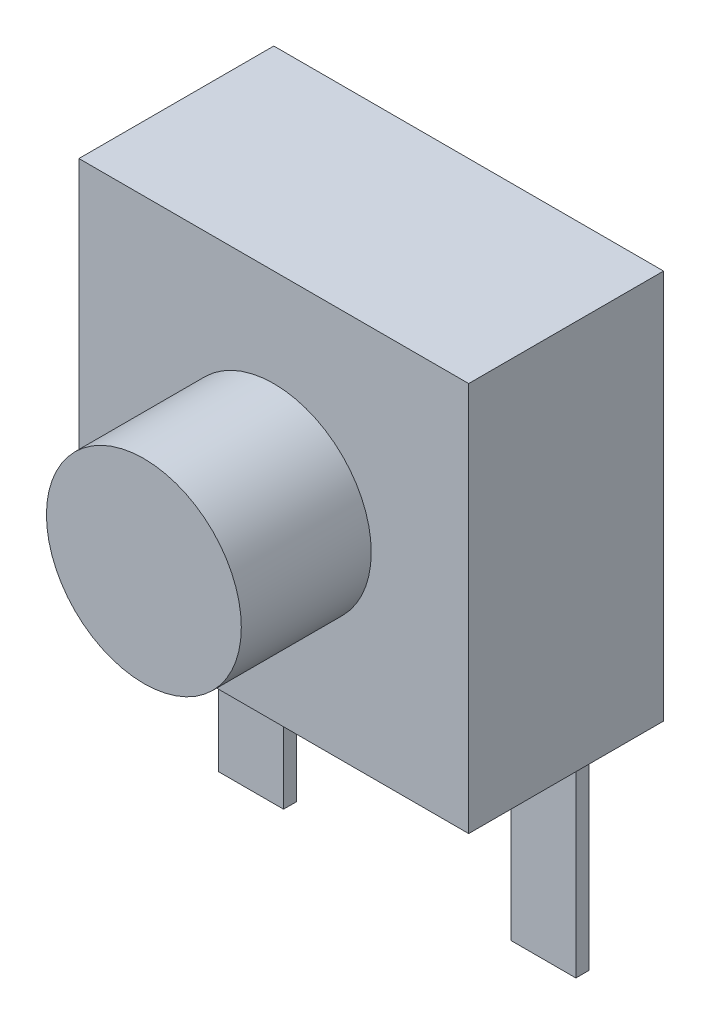
ISO-10303-21;
HEADER;
FILE_DESCRIPTION(('STEP AP214'),'2;1');
FILE_NAME('part.step','',(''),(''),'','','');
FILE_SCHEMA(('AUTOMOTIVE_DESIGN { 1 0 10303 214 1 1 1 1 }'));
ENDSEC;
DATA;
#1=APPLICATION_CONTEXT('core data for automotive mechanical design processes');
#2=APPLICATION_PROTOCOL_DEFINITION('international standard','automotive_design',2000,#1);
#3=PRODUCT_CONTEXT('',#1,'mechanical');
#4=PRODUCT('Part','Part','',(#3));
#5=PRODUCT_RELATED_PRODUCT_CATEGORY('part','',(#4));
#6=PRODUCT_DEFINITION_FORMATION('','',#4);
#7=PRODUCT_DEFINITION_CONTEXT('part definition',#1,'design');
#8=PRODUCT_DEFINITION('design','',#6,#7);
#9=PRODUCT_DEFINITION_SHAPE('','',#8);
#10=(LENGTH_UNIT() NAMED_UNIT(*) SI_UNIT(.MILLI.,.METRE.));
#11=(NAMED_UNIT(*) PLANE_ANGLE_UNIT() SI_UNIT($,.RADIAN.));
#12=(NAMED_UNIT(*) SI_UNIT($,.STERADIAN.) SOLID_ANGLE_UNIT());
#13=UNCERTAINTY_MEASURE_WITH_UNIT(LENGTH_MEASURE(1.E-05),#10,'distance_accuracy_value','');
#14=(GEOMETRIC_REPRESENTATION_CONTEXT(3) GLOBAL_UNCERTAINTY_ASSIGNED_CONTEXT((#13)) GLOBAL_UNIT_ASSIGNED_CONTEXT((#10,
#11,#12)) REPRESENTATION_CONTEXT('',''));
#15=CARTESIAN_POINT('',(0.,0.,0.));
#16=DIRECTION('',(0.,0.,1.));
#17=DIRECTION('',(1.,0.,0.));
#18=AXIS2_PLACEMENT_3D('',#15,#16,#17);
#19=CARTESIAN_POINT('',(-3.00000000000002,-3.,3.));
#20=DIRECTION('',(0.,1.,0.));
#21=DIRECTION('',(0.,0.,1.));
#22=AXIS2_PLACEMENT_3D('',#19,#20,#21);
#23=PLANE('',#22);
#24=DIRECTION('',(0.,0.,-1.));
#25=VECTOR('',#24,1.);
#26=CARTESIAN_POINT('',(-1.75,-3.,1.1));
#27=LINE('',#26,#25);
#28=CARTESIAN_POINT('',(-1.75,-3.,1.1));
#29=VERTEX_POINT('',#28);
#30=CARTESIAN_POINT('',(-1.75,-3.,0.9));
#31=VERTEX_POINT('',#30);
#32=EDGE_CURVE('E157',#29,#31,#27,.T.);
#33=ORIENTED_EDGE('',*,*,#32,.T.);
#34=DIRECTION('',(-1.,0.,0.));
#35=VECTOR('',#34,1.);
#36=CARTESIAN_POINT('',(-1.75,-3.,0.9));
#37=LINE('',#36,#35);
#38=CARTESIAN_POINT('',(-2.75,-3.,0.9));
#39=VERTEX_POINT('',#38);
#40=EDGE_CURVE('E131',#31,#39,#37,.T.);
#41=ORIENTED_EDGE('',*,*,#40,.T.);
#42=DIRECTION('',(0.,0.,1.));
#43=VECTOR('',#42,1.);
#44=CARTESIAN_POINT('',(-2.75,-3.,1.1));
#45=LINE('',#44,#43);
#46=CARTESIAN_POINT('',(-2.75,-3.,1.1));
#47=VERTEX_POINT('',#46);
#48=EDGE_CURVE('E147',#39,#47,#45,.T.);
#49=ORIENTED_EDGE('',*,*,#48,.T.);
#50=DIRECTION('',(1.,0.,0.));
#51=VECTOR('',#50,1.);
#52=CARTESIAN_POINT('',(-1.75,-3.,1.1));
#53=LINE('',#52,#51);
#54=EDGE_CURVE('E51',#47,#29,#53,.T.);
#55=ORIENTED_EDGE('',*,*,#54,.T.);
#56=EDGE_LOOP('',(#33,#41,#49,#55));
#57=FACE_BOUND('',#56,.T.);
#58=DIRECTION('',(1.,0.,0.));
#59=VECTOR('',#58,1.);
#60=CARTESIAN_POINT('',(-3.00000000000002,-3.,0.));
#61=LINE('',#60,#59);
#62=CARTESIAN_POINT('',(-3.00000000000002,-3.,0.));
#63=VERTEX_POINT('',#62);
#64=CARTESIAN_POINT('',(3.,-3.,0.));
#65=VERTEX_POINT('',#64);
#66=EDGE_CURVE('E198',#63,#65,#61,.T.);
#67=ORIENTED_EDGE('',*,*,#66,.T.);
#68=DIRECTION('',(0.,0.,-1.));
#69=VECTOR('',#68,1.);
#70=CARTESIAN_POINT('',(3.,-3.,3.));
#71=LINE('',#70,#69);
#72=CARTESIAN_POINT('',(3.,-3.,3.));
#73=VERTEX_POINT('',#72);
#74=EDGE_CURVE('E44',#73,#65,#71,.T.);
#75=ORIENTED_EDGE('',*,*,#74,.F.);
#76=DIRECTION('',(1.,0.,0.));
#77=VECTOR('',#76,1.);
#78=CARTESIAN_POINT('',(-3.00000000000002,-3.,3.));
#79=LINE('',#78,#77);
#80=CARTESIAN_POINT('',(-3.00000000000002,-3.,3.));
#81=VERTEX_POINT('',#80);
#82=EDGE_CURVE('E199',#81,#73,#79,.T.);
#83=ORIENTED_EDGE('',*,*,#82,.F.);
#84=DIRECTION('',(0.,0.,-1.));
#85=VECTOR('',#84,1.);
#86=CARTESIAN_POINT('',(-3.00000000000002,-3.,3.));
#87=LINE('',#86,#85);
#88=EDGE_CURVE('E209',#81,#63,#87,.T.);
#89=ORIENTED_EDGE('',*,*,#88,.T.);
#90=EDGE_LOOP('',(#67,#75,#83,#89));
#91=FACE_BOUND('',#90,.T.);
#92=DIRECTION('',(1.,0.,0.));
#93=VECTOR('',#92,1.);
#94=CARTESIAN_POINT('',(1.75,-3.,0.9));
#95=LINE('',#94,#93);
#96=CARTESIAN_POINT('',(1.75,-3.,0.9));
#97=VERTEX_POINT('',#96);
#98=CARTESIAN_POINT('',(2.75,-3.,0.9));
#99=VERTEX_POINT('',#98);
#100=EDGE_CURVE('E136',#97,#99,#95,.T.);
#101=ORIENTED_EDGE('',*,*,#100,.F.);
#102=DIRECTION('',(0.,0.,-1.));
#103=VECTOR('',#102,1.);
#104=CARTESIAN_POINT('',(1.75,-3.,1.1));
#105=LINE('',#104,#103);
#106=CARTESIAN_POINT('',(1.75,-3.,1.1));
#107=VERTEX_POINT('',#106);
#108=EDGE_CURVE('E170',#107,#97,#105,.T.);
#109=ORIENTED_EDGE('',*,*,#108,.F.);
#110=DIRECTION('',(-1.,0.,0.));
#111=VECTOR('',#110,1.);
#112=CARTESIAN_POINT('',(1.75,-3.,1.1));
#113=LINE('',#112,#111);
#114=CARTESIAN_POINT('',(2.75,-3.,1.1));
#115=VERTEX_POINT('',#114);
#116=EDGE_CURVE('E180',#115,#107,#113,.T.);
#117=ORIENTED_EDGE('',*,*,#116,.F.);
#118=DIRECTION('',(0.,0.,1.));
#119=VECTOR('',#118,1.);
#120=CARTESIAN_POINT('',(2.75,-3.,1.1));
#121=LINE('',#120,#119);
#122=EDGE_CURVE('E59',#99,#115,#121,.T.);
#123=ORIENTED_EDGE('',*,*,#122,.F.);
#124=EDGE_LOOP('',(#101,#109,#117,#123));
#125=FACE_BOUND('',#124,.T.);
#126=ADVANCED_FACE('F37',(#57,#91,#125),#23,.F.);
#127=CARTESIAN_POINT('',(3.,-3.,3.));
#128=DIRECTION('',(0.,0.,-1.));
#129=DIRECTION('',(-1.,0.,0.));
#130=AXIS2_PLACEMENT_3D('',#127,#128,#129);
#131=PLANE('',#130);
#132=ORIENTED_EDGE('',*,*,#82,.T.);
#133=DIRECTION('',(0.,1.,0.));
#134=VECTOR('',#133,1.);
#135=CARTESIAN_POINT('',(3.,3.,3.));
#136=LINE('',#135,#134);
#137=CARTESIAN_POINT('',(3.,3.,3.));
#138=VERTEX_POINT('',#137);
#139=EDGE_CURVE('E202',#73,#138,#136,.T.);
#140=ORIENTED_EDGE('',*,*,#139,.T.);
#141=DIRECTION('',(-1.,0.,0.));
#142=VECTOR('',#141,1.);
#143=CARTESIAN_POINT('',(-3.00000000000002,3.,3.));
#144=LINE('',#143,#142);
#145=CARTESIAN_POINT('',(-3.00000000000002,3.,3.));
#146=VERTEX_POINT('',#145);
#147=EDGE_CURVE('E205',#138,#146,#144,.T.);
#148=ORIENTED_EDGE('',*,*,#147,.T.);
#149=DIRECTION('',(0.,-1.,0.));
#150=VECTOR('',#149,1.);
#151=CARTESIAN_POINT('',(-3.00000000000002,3.,3.));
#152=LINE('',#151,#150);
#153=EDGE_CURVE('E207',#146,#81,#152,.T.);
#154=ORIENTED_EDGE('',*,*,#153,.T.);
#155=EDGE_LOOP('',(#132,#140,#148,#154));
#156=FACE_BOUND('',#155,.T.);
#157=CARTESIAN_POINT('',(0.,0.,3.));
#158=DIRECTION('',(0.,0.,-1.));
#159=DIRECTION('',(-1.,0.,0.));
#160=AXIS2_PLACEMENT_3D('',#157,#158,#159);
#161=CIRCLE('',#160,1.5);
#162=CARTESIAN_POINT('',(-1.5,0.,3.));
#163=VERTEX_POINT('',#162);
#164=EDGE_CURVE('E11',#163,#163,#161,.F.);
#165=ORIENTED_EDGE('',*,*,#164,.F.);
#166=EDGE_LOOP('',(#165));
#167=FACE_BOUND('',#166,.T.);
#168=ADVANCED_FACE('F245',(#156,#167),#131,.F.);
#169=CARTESIAN_POINT('',(3.,3.,3.));
#170=DIRECTION('',(-1.,0.,0.));
#171=DIRECTION('',(0.,0.,1.));
#172=AXIS2_PLACEMENT_3D('',#169,#170,#171);
#173=PLANE('',#172);
#174=DIRECTION('',(0.,1.,0.));
#175=VECTOR('',#174,1.);
#176=CARTESIAN_POINT('',(3.,3.,0.));
#177=LINE('',#176,#175);
#178=CARTESIAN_POINT('',(3.,3.,0.));
#179=VERTEX_POINT('',#178);
#180=EDGE_CURVE('E212',#65,#179,#177,.T.);
#181=ORIENTED_EDGE('',*,*,#180,.T.);
#182=DIRECTION('',(0.,0.,-1.));
#183=VECTOR('',#182,1.);
#184=CARTESIAN_POINT('',(3.,3.,3.));
#185=LINE('',#184,#183);
#186=EDGE_CURVE('E222',#138,#179,#185,.T.);
#187=ORIENTED_EDGE('',*,*,#186,.F.);
#188=ORIENTED_EDGE('',*,*,#139,.F.);
#189=ORIENTED_EDGE('',*,*,#74,.T.);
#190=EDGE_LOOP('',(#181,#187,#188,#189));
#191=FACE_BOUND('',#190,.T.);
#192=ADVANCED_FACE('F227',(#191),#173,.F.);
#193=CARTESIAN_POINT('',(-3.00000000000002,3.,3.));
#194=DIRECTION('',(0.,-1.,0.));
#195=DIRECTION('',(0.,0.,-1.));
#196=AXIS2_PLACEMENT_3D('',#193,#194,#195);
#197=PLANE('',#196);
#198=DIRECTION('',(-1.,0.,0.));
#199=VECTOR('',#198,1.);
#200=CARTESIAN_POINT('',(-3.00000000000002,3.,0.));
#201=LINE('',#200,#199);
#202=CARTESIAN_POINT('',(-3.00000000000002,3.,0.));
#203=VERTEX_POINT('',#202);
#204=EDGE_CURVE('E214',#179,#203,#201,.T.);
#205=ORIENTED_EDGE('',*,*,#204,.T.);
#206=DIRECTION('',(0.,0.,-1.));
#207=VECTOR('',#206,1.);
#208=CARTESIAN_POINT('',(-3.00000000000002,3.,3.));
#209=LINE('',#208,#207);
#210=EDGE_CURVE('E219',#146,#203,#209,.T.);
#211=ORIENTED_EDGE('',*,*,#210,.F.);
#212=ORIENTED_EDGE('',*,*,#147,.F.);
#213=ORIENTED_EDGE('',*,*,#186,.T.);
#214=EDGE_LOOP('',(#205,#211,#212,#213));
#215=FACE_BOUND('',#214,.T.);
#216=ADVANCED_FACE('F239',(#215),#197,.F.);
#217=CARTESIAN_POINT('',(-3.00000000000002,3.,3.));
#218=DIRECTION('',(1.,0.,0.));
#219=DIRECTION('',(0.,0.,-1.));
#220=AXIS2_PLACEMENT_3D('',#217,#218,#219);
#221=PLANE('',#220);
#222=DIRECTION('',(0.,-1.,0.));
#223=VECTOR('',#222,1.);
#224=CARTESIAN_POINT('',(-3.00000000000002,3.,0.));
#225=LINE('',#224,#223);
#226=EDGE_CURVE('E203',#203,#63,#225,.T.);
#227=ORIENTED_EDGE('',*,*,#226,.T.);
#228=ORIENTED_EDGE('',*,*,#88,.F.);
#229=ORIENTED_EDGE('',*,*,#153,.F.);
#230=ORIENTED_EDGE('',*,*,#210,.T.);
#231=EDGE_LOOP('',(#227,#228,#229,#230));
#232=FACE_BOUND('',#231,.T.);
#233=ADVANCED_FACE('F243',(#232),#221,.F.);
#234=CARTESIAN_POINT('',(3.,-3.,0.));
#235=DIRECTION('',(0.,0.,-1.));
#236=DIRECTION('',(-1.,0.,0.));
#237=AXIS2_PLACEMENT_3D('',#234,#235,#236);
#238=PLANE('',#237);
#239=ORIENTED_EDGE('',*,*,#66,.F.);
#240=ORIENTED_EDGE('',*,*,#226,.F.);
#241=ORIENTED_EDGE('',*,*,#204,.F.);
#242=ORIENTED_EDGE('',*,*,#180,.F.);
#243=EDGE_LOOP('',(#239,#240,#241,#242));
#244=FACE_BOUND('',#243,.T.);
#245=ADVANCED_FACE('F235',(#244),#238,.T.);
#246=CARTESIAN_POINT('',(0.,0.,5.));
#247=DIRECTION('',(0.,0.,-1.));
#248=DIRECTION('',(-1.,0.,0.));
#249=AXIS2_PLACEMENT_3D('',#246,#247,#248);
#250=CYLINDRICAL_SURFACE('',#249,1.5);
#251=CARTESIAN_POINT('',(0.,0.,5.));
#252=DIRECTION('',(0.,0.,1.));
#253=DIRECTION('',(1.,0.,0.));
#254=AXIS2_PLACEMENT_3D('',#251,#252,#253);
#255=CIRCLE('',#254,1.5);
#256=CARTESIAN_POINT('',(1.5,0.,5.));
#257=VERTEX_POINT('',#256);
#258=EDGE_CURVE('E195',#257,#257,#255,.T.);
#259=ORIENTED_EDGE('',*,*,#258,.F.);
#260=EDGE_LOOP('',(#259));
#261=FACE_BOUND('',#260,.T.);
#262=ORIENTED_EDGE('',*,*,#164,.T.);
#263=EDGE_LOOP('',(#262));
#264=FACE_BOUND('',#263,.T.);
#265=ADVANCED_FACE('F251',(#261,#264),#250,.T.);
#266=CARTESIAN_POINT('',(0.,0.,5.));
#267=DIRECTION('',(0.,0.,1.));
#268=DIRECTION('',(1.,0.,0.));
#269=AXIS2_PLACEMENT_3D('',#266,#267,#268);
#270=PLANE('',#269);
#271=ORIENTED_EDGE('',*,*,#258,.T.);
#272=EDGE_LOOP('',(#271));
#273=FACE_BOUND('',#272,.T.);
#274=ADVANCED_FACE('F253',(#273),#270,.T.);
#275=CARTESIAN_POINT('',(1.75,-6.,0.899999999999999));
#276=DIRECTION('',(0.,0.,1.));
#277=DIRECTION('',(1.,0.,0.));
#278=AXIS2_PLACEMENT_3D('',#275,#276,#277);
#279=PLANE('',#278);
#280=ORIENTED_EDGE('',*,*,#100,.T.);
#281=DIRECTION('',(0.,1.,0.));
#282=VECTOR('',#281,1.);
#283=CARTESIAN_POINT('',(2.75,-6.,0.9));
#284=LINE('',#283,#282);
#285=CARTESIAN_POINT('',(2.75,-6.,0.9));
#286=VERTEX_POINT('',#285);
#287=EDGE_CURVE('E193',#286,#99,#284,.T.);
#288=ORIENTED_EDGE('',*,*,#287,.F.);
#289=DIRECTION('',(1.,0.,0.));
#290=VECTOR('',#289,1.);
#291=CARTESIAN_POINT('',(1.75,-6.,0.899999999999999));
#292=LINE('',#291,#290);
#293=CARTESIAN_POINT('',(1.75,-6.,0.899999999999999));
#294=VERTEX_POINT('',#293);
#295=EDGE_CURVE('E166',#294,#286,#292,.T.);
#296=ORIENTED_EDGE('',*,*,#295,.F.);
#297=DIRECTION('',(0.,1.,0.));
#298=VECTOR('',#297,1.);
#299=CARTESIAN_POINT('',(1.75,-6.,0.899999999999999));
#300=LINE('',#299,#298);
#301=EDGE_CURVE('E176',#294,#97,#300,.T.);
#302=ORIENTED_EDGE('',*,*,#301,.T.);
#303=EDGE_LOOP('',(#280,#288,#296,#302));
#304=FACE_BOUND('',#303,.T.);
#305=ADVANCED_FACE('F260',(#304),#279,.F.);
#306=CARTESIAN_POINT('',(2.75,-6.,1.1));
#307=DIRECTION('',(-1.,0.,0.));
#308=DIRECTION('',(0.,0.,1.));
#309=AXIS2_PLACEMENT_3D('',#306,#307,#308);
#310=PLANE('',#309);
#311=ORIENTED_EDGE('',*,*,#122,.T.);
#312=DIRECTION('',(0.,1.,0.));
#313=VECTOR('',#312,1.);
#314=CARTESIAN_POINT('',(2.75,-6.,1.1));
#315=LINE('',#314,#313);
#316=CARTESIAN_POINT('',(2.75,-6.,1.1));
#317=VERTEX_POINT('',#316);
#318=EDGE_CURVE('E190',#317,#115,#315,.T.);
#319=ORIENTED_EDGE('',*,*,#318,.F.);
#320=DIRECTION('',(0.,0.,1.));
#321=VECTOR('',#320,1.);
#322=CARTESIAN_POINT('',(2.75,-6.,1.1));
#323=LINE('',#322,#321);
#324=EDGE_CURVE('E169',#286,#317,#323,.T.);
#325=ORIENTED_EDGE('',*,*,#324,.F.);
#326=ORIENTED_EDGE('',*,*,#287,.T.);
#327=EDGE_LOOP('',(#311,#319,#325,#326));
#328=FACE_BOUND('',#327,.T.);
#329=ADVANCED_FACE('F296',(#328),#310,.F.);
#330=CARTESIAN_POINT('',(1.75,-6.,1.1));
#331=DIRECTION('',(0.,0.,-1.));
#332=DIRECTION('',(-1.,0.,0.));
#333=AXIS2_PLACEMENT_3D('',#330,#331,#332);
#334=PLANE('',#333);
#335=ORIENTED_EDGE('',*,*,#116,.T.);
#336=DIRECTION('',(0.,1.,0.));
#337=VECTOR('',#336,1.);
#338=CARTESIAN_POINT('',(1.75,-6.,1.1));
#339=LINE('',#338,#337);
#340=CARTESIAN_POINT('',(1.75,-6.,1.1));
#341=VERTEX_POINT('',#340);
#342=EDGE_CURVE('E187',#341,#107,#339,.T.);
#343=ORIENTED_EDGE('',*,*,#342,.F.);
#344=DIRECTION('',(-1.,0.,0.));
#345=VECTOR('',#344,1.);
#346=CARTESIAN_POINT('',(1.75,-6.,1.1));
#347=LINE('',#346,#345);
#348=EDGE_CURVE('E172',#317,#341,#347,.T.);
#349=ORIENTED_EDGE('',*,*,#348,.F.);
#350=ORIENTED_EDGE('',*,*,#318,.T.);
#351=EDGE_LOOP('',(#335,#343,#349,#350));
#352=FACE_BOUND('',#351,.T.);
#353=ADVANCED_FACE('F292',(#352),#334,.F.);
#354=CARTESIAN_POINT('',(1.75,-6.,1.1));
#355=DIRECTION('',(1.,0.,0.));
#356=DIRECTION('',(0.,0.,-1.));
#357=AXIS2_PLACEMENT_3D('',#354,#355,#356);
#358=PLANE('',#357);
#359=ORIENTED_EDGE('',*,*,#108,.T.);
#360=ORIENTED_EDGE('',*,*,#301,.F.);
#361=DIRECTION('',(0.,0.,-1.));
#362=VECTOR('',#361,1.);
#363=CARTESIAN_POINT('',(1.75,-6.,1.1));
#364=LINE('',#363,#362);
#365=EDGE_CURVE('E174',#341,#294,#364,.T.);
#366=ORIENTED_EDGE('',*,*,#365,.F.);
#367=ORIENTED_EDGE('',*,*,#342,.T.);
#368=EDGE_LOOP('',(#359,#360,#366,#367));
#369=FACE_BOUND('',#368,.T.);
#370=ADVANCED_FACE('F288',(#369),#358,.F.);
#371=CARTESIAN_POINT('',(2.75,-6.,0.9));
#372=DIRECTION('',(0.,1.,0.));
#373=DIRECTION('',(0.,0.,1.));
#374=AXIS2_PLACEMENT_3D('',#371,#372,#373);
#375=PLANE('',#374);
#376=ORIENTED_EDGE('',*,*,#295,.T.);
#377=ORIENTED_EDGE('',*,*,#324,.T.);
#378=ORIENTED_EDGE('',*,*,#348,.T.);
#379=ORIENTED_EDGE('',*,*,#365,.T.);
#380=EDGE_LOOP('',(#376,#377,#378,#379));
#381=FACE_BOUND('',#380,.T.);
#382=ADVANCED_FACE('F285',(#381),#375,.F.);
#383=CARTESIAN_POINT('',(-1.75,-6.,0.899999999999999));
#384=DIRECTION('',(0.,0.,-1.));
#385=DIRECTION('',(-1.,0.,0.));
#386=AXIS2_PLACEMENT_3D('',#383,#384,#385);
#387=PLANE('',#386);
#388=ORIENTED_EDGE('',*,*,#40,.F.);
#389=DIRECTION('',(0.,1.,0.));
#390=VECTOR('',#389,1.);
#391=CARTESIAN_POINT('',(-1.75,-6.,0.899999999999999));
#392=LINE('',#391,#390);
#393=CARTESIAN_POINT('',(-1.75,-6.,0.899999999999999));
#394=VERTEX_POINT('',#393);
#395=EDGE_CURVE('E125',#394,#31,#392,.T.);
#396=ORIENTED_EDGE('',*,*,#395,.F.);
#397=DIRECTION('',(-1.,0.,0.));
#398=VECTOR('',#397,1.);
#399=CARTESIAN_POINT('',(-1.75,-6.,0.899999999999999));
#400=LINE('',#399,#398);
#401=CARTESIAN_POINT('',(-2.75,-6.,0.9));
#402=VERTEX_POINT('',#401);
#403=EDGE_CURVE('E128',#394,#402,#400,.T.);
#404=ORIENTED_EDGE('',*,*,#403,.T.);
#405=DIRECTION('',(0.,1.,0.));
#406=VECTOR('',#405,1.);
#407=CARTESIAN_POINT('',(-2.75,-6.,0.9));
#408=LINE('',#407,#406);
#409=EDGE_CURVE('E155',#402,#39,#408,.T.);
#410=ORIENTED_EDGE('',*,*,#409,.T.);
#411=EDGE_LOOP('',(#388,#396,#404,#410));
#412=FACE_BOUND('',#411,.T.);
#413=ADVANCED_FACE('F127',(#412),#387,.T.);
#414=CARTESIAN_POINT('',(-1.75,-6.,1.1));
#415=DIRECTION('',(1.,0.,0.));
#416=DIRECTION('',(0.,0.,-1.));
#417=AXIS2_PLACEMENT_3D('',#414,#415,#416);
#418=PLANE('',#417);
#419=ORIENTED_EDGE('',*,*,#32,.F.);
#420=DIRECTION('',(0.,1.,0.));
#421=VECTOR('',#420,1.);
#422=CARTESIAN_POINT('',(-1.75,-6.,1.1));
#423=LINE('',#422,#421);
#424=CARTESIAN_POINT('',(-1.75,-6.,1.1));
#425=VERTEX_POINT('',#424);
#426=EDGE_CURVE('E137',#425,#29,#423,.T.);
#427=ORIENTED_EDGE('',*,*,#426,.F.);
#428=DIRECTION('',(0.,0.,-1.));
#429=VECTOR('',#428,1.);
#430=CARTESIAN_POINT('',(-1.75,-6.,1.1));
#431=LINE('',#430,#429);
#432=EDGE_CURVE('E143',#425,#394,#431,.T.);
#433=ORIENTED_EDGE('',*,*,#432,.T.);
#434=ORIENTED_EDGE('',*,*,#395,.T.);
#435=EDGE_LOOP('',(#419,#427,#433,#434));
#436=FACE_BOUND('',#435,.T.);
#437=ADVANCED_FACE('F149',(#436),#418,.T.);
#438=CARTESIAN_POINT('',(-1.75,-6.,1.1));
#439=DIRECTION('',(0.,0.,1.));
#440=DIRECTION('',(1.,0.,0.));
#441=AXIS2_PLACEMENT_3D('',#438,#439,#440);
#442=PLANE('',#441);
#443=ORIENTED_EDGE('',*,*,#54,.F.);
#444=DIRECTION('',(0.,1.,0.));
#445=VECTOR('',#444,1.);
#446=CARTESIAN_POINT('',(-2.75,-6.,1.1));
#447=LINE('',#446,#445);
#448=CARTESIAN_POINT('',(-2.75,-6.,1.1));
#449=VERTEX_POINT('',#448);
#450=EDGE_CURVE('E163',#449,#47,#447,.T.);
#451=ORIENTED_EDGE('',*,*,#450,.F.);
#452=DIRECTION('',(1.,0.,0.));
#453=VECTOR('',#452,1.);
#454=CARTESIAN_POINT('',(-1.75,-6.,1.1));
#455=LINE('',#454,#453);
#456=EDGE_CURVE('E150',#449,#425,#455,.T.);
#457=ORIENTED_EDGE('',*,*,#456,.T.);
#458=ORIENTED_EDGE('',*,*,#426,.T.);
#459=EDGE_LOOP('',(#443,#451,#457,#458));
#460=FACE_BOUND('',#459,.T.);
#461=ADVANCED_FACE('F272',(#460),#442,.T.);
#462=CARTESIAN_POINT('',(-2.75,-6.,1.1));
#463=DIRECTION('',(-1.,0.,0.));
#464=DIRECTION('',(0.,0.,1.));
#465=AXIS2_PLACEMENT_3D('',#462,#463,#464);
#466=PLANE('',#465);
#467=ORIENTED_EDGE('',*,*,#48,.F.);
#468=ORIENTED_EDGE('',*,*,#409,.F.);
#469=DIRECTION('',(0.,0.,1.));
#470=VECTOR('',#469,1.);
#471=CARTESIAN_POINT('',(-2.75,-6.,1.1));
#472=LINE('',#471,#470);
#473=EDGE_CURVE('E146',#402,#449,#472,.T.);
#474=ORIENTED_EDGE('',*,*,#473,.T.);
#475=ORIENTED_EDGE('',*,*,#450,.T.);
#476=EDGE_LOOP('',(#467,#468,#474,#475));
#477=FACE_BOUND('',#476,.T.);
#478=ADVANCED_FACE('F271',(#477),#466,.T.);
#479=CARTESIAN_POINT('',(-2.75,-6.,0.9));
#480=DIRECTION('',(0.,1.,0.));
#481=DIRECTION('',(0.,0.,1.));
#482=AXIS2_PLACEMENT_3D('',#479,#480,#481);
#483=PLANE('',#482);
#484=ORIENTED_EDGE('',*,*,#403,.F.);
#485=ORIENTED_EDGE('',*,*,#432,.F.);
#486=ORIENTED_EDGE('',*,*,#456,.F.);
#487=ORIENTED_EDGE('',*,*,#473,.F.);
#488=EDGE_LOOP('',(#484,#485,#486,#487));
#489=FACE_BOUND('',#488,.T.);
#490=ADVANCED_FACE('F141',(#489),#483,.F.);
#491=CLOSED_SHELL('',(#126,#168,#192,#216,#233,#245,#265,#274,#305,#329,#353,#370,#382,#413,
#437,#461,#478,#490));
#492=MANIFOLD_SOLID_BREP('B2',#491);
#493=ADVANCED_BREP_SHAPE_REPRESENTATION('',(#18,#492),#14);
#494=SHAPE_DEFINITION_REPRESENTATION(#9,#493);
ENDSEC;
END-ISO-10303-21;
